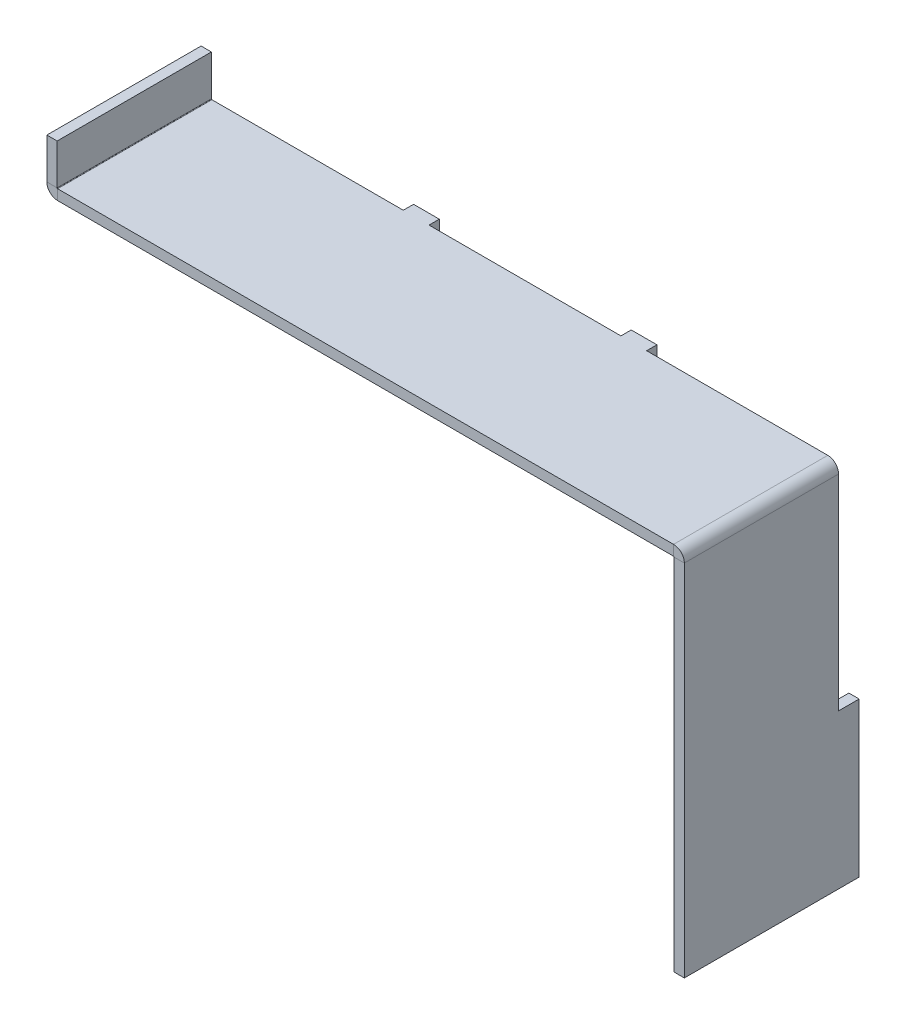
ISO-10303-21;
HEADER;
FILE_DESCRIPTION(('STEP AP214'),'2;1');
FILE_NAME('part.step','',(''),(''),'','','');
FILE_SCHEMA(('AUTOMOTIVE_DESIGN { 1 0 10303 214 1 1 1 1 }'));
ENDSEC;
DATA;
#1=APPLICATION_CONTEXT('core data for automotive mechanical design processes');
#2=APPLICATION_PROTOCOL_DEFINITION('international standard','automotive_design',2000,#1);
#3=PRODUCT_CONTEXT('',#1,'mechanical');
#4=PRODUCT('Part','Part','',(#3));
#5=PRODUCT_RELATED_PRODUCT_CATEGORY('part','',(#4));
#6=PRODUCT_DEFINITION_FORMATION('','',#4);
#7=PRODUCT_DEFINITION_CONTEXT('part definition',#1,'design');
#8=PRODUCT_DEFINITION('design','',#6,#7);
#9=PRODUCT_DEFINITION_SHAPE('','',#8);
#10=(LENGTH_UNIT() NAMED_UNIT(*) SI_UNIT(.MILLI.,.METRE.));
#11=(NAMED_UNIT(*) PLANE_ANGLE_UNIT() SI_UNIT($,.RADIAN.));
#12=(NAMED_UNIT(*) SI_UNIT($,.STERADIAN.) SOLID_ANGLE_UNIT());
#13=UNCERTAINTY_MEASURE_WITH_UNIT(LENGTH_MEASURE(1.E-05),#10,'distance_accuracy_value','');
#14=(GEOMETRIC_REPRESENTATION_CONTEXT(3) GLOBAL_UNCERTAINTY_ASSIGNED_CONTEXT((#13)) GLOBAL_UNIT_ASSIGNED_CONTEXT((#10,
#11,#12)) REPRESENTATION_CONTEXT('',''));
#15=CARTESIAN_POINT('',(0.,0.,0.));
#16=DIRECTION('',(0.,0.,1.));
#17=DIRECTION('',(1.,0.,0.));
#18=AXIS2_PLACEMENT_3D('',#15,#16,#17);
#19=CARTESIAN_POINT('',(-741.460734592372,-30.,146.));
#20=DIRECTION('',(0.,0.,-1.));
#21=DIRECTION('',(0.,1.,0.));
#22=AXIS2_PLACEMENT_3D('',#19,#20,#21);
#23=PLANE('',#22);
#24=DIRECTION('',(1.,0.,0.));
#25=VECTOR('',#24,1.);
#26=CARTESIAN_POINT('',(-741.460734592372,-1.11022302462516E-13,146.));
#27=LINE('',#26,#25);
#28=CARTESIAN_POINT('',(-588.,-1.11022302462516E-13,146.));
#29=VERTEX_POINT('',#28);
#30=CARTESIAN_POINT('',(-586.,-1.11022302462516E-13,146.));
#31=VERTEX_POINT('',#30);
#32=EDGE_CURVE('E453',#29,#31,#27,.T.);
#33=ORIENTED_EDGE('',*,*,#32,.T.);
#34=DIRECTION('',(0.,-1.,0.));
#35=VECTOR('',#34,1.);
#36=CARTESIAN_POINT('',(-586.,-1.11022302462516E-13,146.));
#37=LINE('',#36,#35);
#38=CARTESIAN_POINT('',(-586.,-30.,146.));
#39=VERTEX_POINT('',#38);
#40=EDGE_CURVE('E449',#31,#39,#37,.T.);
#41=ORIENTED_EDGE('',*,*,#40,.T.);
#42=DIRECTION('',(1.,0.,0.));
#43=VECTOR('',#42,1.);
#44=CARTESIAN_POINT('',(-741.460734592372,-30.,146.));
#45=LINE('',#44,#43);
#46=CARTESIAN_POINT('',(-588.,-30.,146.));
#47=VERTEX_POINT('',#46);
#48=EDGE_CURVE('E448',#47,#39,#45,.T.);
#49=ORIENTED_EDGE('',*,*,#48,.F.);
#50=DIRECTION('',(0.,1.,0.));
#51=VECTOR('',#50,1.);
#52=CARTESIAN_POINT('',(-588.,-30.,146.));
#53=LINE('',#52,#51);
#54=EDGE_CURVE('E444',#47,#29,#53,.T.);
#55=ORIENTED_EDGE('',*,*,#54,.T.);
#56=EDGE_LOOP('',(#33,#41,#49,#55));
#57=FACE_BOUND('',#56,.T.);
#58=ADVANCED_FACE('F45',(#57),#23,.T.);
#59=CARTESIAN_POINT('',(-741.460734592372,-30.,180.));
#60=DIRECTION('',(0.,-1.,0.));
#61=DIRECTION('',(1.,0.,0.));
#62=AXIS2_PLACEMENT_3D('',#59,#60,#61);
#63=PLANE('',#62);
#64=ORIENTED_EDGE('',*,*,#48,.T.);
#65=DIRECTION('',(0.,0.,-1.));
#66=VECTOR('',#65,1.);
#67=CARTESIAN_POINT('',(-586.,-30.,180.));
#68=LINE('',#67,#66);
#69=CARTESIAN_POINT('',(-586.,-30.,180.));
#70=VERTEX_POINT('',#69);
#71=EDGE_CURVE('E424',#70,#39,#68,.T.);
#72=ORIENTED_EDGE('',*,*,#71,.F.);
#73=DIRECTION('',(1.,0.,0.));
#74=VECTOR('',#73,1.);
#75=CARTESIAN_POINT('',(-741.460734592372,-30.,180.));
#76=LINE('',#75,#74);
#77=CARTESIAN_POINT('',(-588.,-30.,180.));
#78=VERTEX_POINT('',#77);
#79=EDGE_CURVE('E421',#78,#70,#76,.T.);
#80=ORIENTED_EDGE('',*,*,#79,.F.);
#81=DIRECTION('',(0.,0.,-1.));
#82=VECTOR('',#81,1.);
#83=CARTESIAN_POINT('',(-588.,-30.,180.));
#84=LINE('',#83,#82);
#85=EDGE_CURVE('E525',#78,#47,#84,.T.);
#86=ORIENTED_EDGE('',*,*,#85,.T.);
#87=EDGE_LOOP('',(#64,#72,#80,#86));
#88=FACE_BOUND('',#87,.T.);
#89=ADVANCED_FACE('F524',(#88),#63,.T.);
#90=CARTESIAN_POINT('',(-741.460734592372,-1.11022302462516E-13,146.));
#91=DIRECTION('',(0.,1.,0.));
#92=DIRECTION('',(-1.,0.,0.));
#93=AXIS2_PLACEMENT_3D('',#90,#91,#92);
#94=PLANE('',#93);
#95=DIRECTION('',(1.,0.,0.));
#96=VECTOR('',#95,1.);
#97=CARTESIAN_POINT('',(-741.460734592372,-1.11022302462516E-13,150.));
#98=LINE('',#97,#96);
#99=CARTESIAN_POINT('',(-588.,-1.11022302462516E-13,150.));
#100=VERTEX_POINT('',#99);
#101=CARTESIAN_POINT('',(-586.,-1.11022302462516E-13,150.));
#102=VERTEX_POINT('',#101);
#103=EDGE_CURVE('E530',#100,#102,#98,.T.);
#104=ORIENTED_EDGE('',*,*,#103,.T.);
#105=DIRECTION('',(0.,0.,-1.));
#106=VECTOR('',#105,1.);
#107=CARTESIAN_POINT('',(-586.,-1.11022302462516E-13,0.));
#108=LINE('',#107,#106);
#109=EDGE_CURVE('E435',#102,#31,#108,.T.);
#110=ORIENTED_EDGE('',*,*,#109,.T.);
#111=ORIENTED_EDGE('',*,*,#32,.F.);
#112=DIRECTION('',(0.,0.,1.));
#113=VECTOR('',#112,1.);
#114=CARTESIAN_POINT('',(-588.,-1.11022302462516E-13,146.));
#115=LINE('',#114,#113);
#116=EDGE_CURVE('E432',#29,#100,#115,.T.);
#117=ORIENTED_EDGE('',*,*,#116,.T.);
#118=EDGE_LOOP('',(#104,#110,#111,#117));
#119=FACE_BOUND('',#118,.T.);
#120=ADVANCED_FACE('F537',(#119),#94,.T.);
#121=CARTESIAN_POINT('',(-741.460734592372,41.9999999999999,150.));
#122=DIRECTION('',(0.,0.,1.));
#123=DIRECTION('',(0.,-1.,0.));
#124=AXIS2_PLACEMENT_3D('',#121,#122,#123);
#125=PLANE('',#124);
#126=DIRECTION('',(0.,-1.,0.));
#127=VECTOR('',#126,1.);
#128=CARTESIAN_POINT('',(-586.,-1.11022302462516E-13,150.));
#129=LINE('',#128,#127);
#130=CARTESIAN_POINT('',(-586.,39.8999999999999,150.));
#131=VERTEX_POINT('',#130);
#132=EDGE_CURVE('E428',#131,#102,#129,.T.);
#133=ORIENTED_EDGE('',*,*,#132,.T.);
#134=ORIENTED_EDGE('',*,*,#103,.F.);
#135=DIRECTION('',(0.,-1.,0.));
#136=VECTOR('',#135,1.);
#137=CARTESIAN_POINT('',(-588.,41.9999999999999,150.));
#138=LINE('',#137,#136);
#139=CARTESIAN_POINT('',(-588.,39.8999999999999,150.));
#140=VERTEX_POINT('',#139);
#141=EDGE_CURVE('E12',#140,#100,#138,.T.);
#142=ORIENTED_EDGE('',*,*,#141,.F.);
#143=DIRECTION('',(1.,0.,0.));
#144=VECTOR('',#143,1.);
#145=CARTESIAN_POINT('',(-741.460734592372,39.8999999999999,150.));
#146=LINE('',#145,#144);
#147=EDGE_CURVE('E427',#140,#131,#146,.T.);
#148=ORIENTED_EDGE('',*,*,#147,.T.);
#149=EDGE_LOOP('',(#133,#134,#142,#148));
#150=FACE_BOUND('',#149,.T.);
#151=ADVANCED_FACE('F538',(#150),#125,.F.);
#152=CARTESIAN_POINT('',(-586.,-1.11022302462516E-13,0.));
#153=DIRECTION('',(1.,0.,0.));
#154=DIRECTION('',(0.,0.,-1.));
#155=AXIS2_PLACEMENT_3D('',#152,#153,#154);
#156=PLANE('',#155);
#157=DIRECTION('',(0.,0.,-1.));
#158=VECTOR('',#157,1.);
#159=CARTESIAN_POINT('',(-586.,39.8999999999999,150.));
#160=LINE('',#159,#158);
#161=CARTESIAN_POINT('',(-586.,39.8999999999999,180.));
#162=VERTEX_POINT('',#161);
#163=EDGE_CURVE('E455',#162,#131,#160,.T.);
#164=ORIENTED_EDGE('',*,*,#163,.F.);
#165=DIRECTION('',(0.,1.,0.));
#166=VECTOR('',#165,1.);
#167=CARTESIAN_POINT('',(-586.,41.9999999999999,180.));
#168=LINE('',#167,#166);
#169=EDGE_CURVE('E417',#70,#162,#168,.T.);
#170=ORIENTED_EDGE('',*,*,#169,.F.);
#171=ORIENTED_EDGE('',*,*,#71,.T.);
#172=ORIENTED_EDGE('',*,*,#40,.F.);
#173=ORIENTED_EDGE('',*,*,#109,.F.);
#174=ORIENTED_EDGE('',*,*,#132,.F.);
#175=EDGE_LOOP('',(#164,#170,#171,#172,#173,#174));
#176=FACE_BOUND('',#175,.T.);
#177=ADVANCED_FACE('F518',(#176),#156,.T.);
#178=CARTESIAN_POINT('',(-741.460734592372,41.9999999999999,180.));
#179=DIRECTION('',(0.,0.,1.));
#180=DIRECTION('',(0.,-1.,0.));
#181=AXIS2_PLACEMENT_3D('',#178,#179,#180);
#182=PLANE('',#181);
#183=ORIENTED_EDGE('',*,*,#79,.T.);
#184=ORIENTED_EDGE('',*,*,#169,.T.);
#185=DIRECTION('',(1.,0.,0.));
#186=VECTOR('',#185,1.);
#187=CARTESIAN_POINT('',(-741.460734592372,39.8999999999999,180.));
#188=LINE('',#187,#186);
#189=CARTESIAN_POINT('',(-588.,39.8999999999999,180.));
#190=VERTEX_POINT('',#189);
#191=EDGE_CURVE('E49',#190,#162,#188,.T.);
#192=ORIENTED_EDGE('',*,*,#191,.F.);
#193=DIRECTION('',(0.,1.,0.));
#194=VECTOR('',#193,1.);
#195=CARTESIAN_POINT('',(-588.,41.9999999999999,180.));
#196=LINE('',#195,#194);
#197=EDGE_CURVE('E64',#78,#190,#196,.T.);
#198=ORIENTED_EDGE('',*,*,#197,.F.);
#199=EDGE_LOOP('',(#183,#184,#192,#198));
#200=FACE_BOUND('',#199,.T.);
#201=ADVANCED_FACE('F520',(#200),#182,.T.);
#202=CARTESIAN_POINT('',(-588.,-1.11022302462516E-13,0.));
#203=DIRECTION('',(1.,0.,0.));
#204=DIRECTION('',(0.,0.,-1.));
#205=AXIS2_PLACEMENT_3D('',#202,#203,#204);
#206=PLANE('',#205);
#207=ORIENTED_EDGE('',*,*,#197,.T.);
#208=DIRECTION('',(0.,0.,-1.));
#209=VECTOR('',#208,1.);
#210=CARTESIAN_POINT('',(-588.,39.8999999999999,150.));
#211=LINE('',#210,#209);
#212=EDGE_CURVE('E55',#190,#140,#211,.T.);
#213=ORIENTED_EDGE('',*,*,#212,.T.);
#214=ORIENTED_EDGE('',*,*,#141,.T.);
#215=ORIENTED_EDGE('',*,*,#116,.F.);
#216=ORIENTED_EDGE('',*,*,#54,.F.);
#217=ORIENTED_EDGE('',*,*,#85,.F.);
#218=EDGE_LOOP('',(#207,#213,#214,#215,#216,#217));
#219=FACE_BOUND('',#218,.T.);
#220=ADVANCED_FACE('F47',(#219),#206,.F.);
#221=CARTESIAN_POINT('',(-645.954532800534,50.,148.));
#222=DIRECTION('',(0.,1.,0.));
#223=DIRECTION('',(-1.,0.,0.));
#224=AXIS2_PLACEMENT_3D('',#221,#222,#223);
#225=PLANE('',#224);
#226=DIRECTION('',(0.,0.,-1.));
#227=VECTOR('',#226,1.);
#228=CARTESIAN_POINT('',(-710.,50.,180.));
#229=LINE('',#228,#227);
#230=CARTESIAN_POINT('',(-710.,50.0000000000002,180.));
#231=VERTEX_POINT('',#230);
#232=CARTESIAN_POINT('',(-710.,50.,150.));
#233=VERTEX_POINT('',#232);
#234=EDGE_CURVE('E352',#231,#233,#229,.T.);
#235=ORIENTED_EDGE('',*,*,#234,.F.);
#236=DIRECTION('',(-1.,0.,0.));
#237=VECTOR('',#236,1.);
#238=CARTESIAN_POINT('',(-645.954532800534,50.0000000000002,180.));
#239=LINE('',#238,#237);
#240=CARTESIAN_POINT('',(-708.,50.0000000000002,180.));
#241=VERTEX_POINT('',#240);
#242=EDGE_CURVE('E372',#241,#231,#239,.T.);
#243=ORIENTED_EDGE('',*,*,#242,.F.);
#244=DIRECTION('',(0.,0.,-1.));
#245=VECTOR('',#244,1.);
#246=CARTESIAN_POINT('',(-708.,50.,148.));
#247=LINE('',#246,#245);
#248=CARTESIAN_POINT('',(-708.,50.,150.));
#249=VERTEX_POINT('',#248);
#250=EDGE_CURVE('E108',#241,#249,#247,.T.);
#251=ORIENTED_EDGE('',*,*,#250,.T.);
#252=DIRECTION('',(-1.,0.,0.));
#253=VECTOR('',#252,1.);
#254=CARTESIAN_POINT('',(-645.954532800534,50.,150.));
#255=LINE('',#254,#253);
#256=EDGE_CURVE('E479',#249,#233,#255,.T.);
#257=ORIENTED_EDGE('',*,*,#256,.T.);
#258=EDGE_LOOP('',(#235,#243,#251,#257));
#259=FACE_BOUND('',#258,.T.);
#260=ADVANCED_FACE('F494',(#259),#225,.T.);
#261=CARTESIAN_POINT('',(-645.954532800534,450.,150.));
#262=DIRECTION('',(0.,0.,-1.));
#263=DIRECTION('',(0.,1.,0.));
#264=AXIS2_PLACEMENT_3D('',#261,#262,#263);
#265=PLANE('',#264);
#266=DIRECTION('',(0.,-1.,0.));
#267=VECTOR('',#266,1.);
#268=CARTESIAN_POINT('',(-710.,40.0000000000001,150.));
#269=LINE('',#268,#267);
#270=CARTESIAN_POINT('',(-710.,42.1,150.));
#271=VERTEX_POINT('',#270);
#272=EDGE_CURVE('E130',#233,#271,#269,.T.);
#273=ORIENTED_EDGE('',*,*,#272,.F.);
#274=ORIENTED_EDGE('',*,*,#256,.F.);
#275=DIRECTION('',(0.,-1.,0.));
#276=VECTOR('',#275,1.);
#277=CARTESIAN_POINT('',(-708.,450.,150.));
#278=LINE('',#277,#276);
#279=CARTESIAN_POINT('',(-708.,42.1,150.));
#280=VERTEX_POINT('',#279);
#281=EDGE_CURVE('E480',#249,#280,#278,.T.);
#282=ORIENTED_EDGE('',*,*,#281,.T.);
#283=DIRECTION('',(-1.,0.,0.));
#284=VECTOR('',#283,1.);
#285=CARTESIAN_POINT('',(-645.954532800534,42.1,150.));
#286=LINE('',#285,#284);
#287=EDGE_CURVE('E357',#280,#271,#286,.T.);
#288=ORIENTED_EDGE('',*,*,#287,.T.);
#289=EDGE_LOOP('',(#273,#274,#282,#288));
#290=FACE_BOUND('',#289,.T.);
#291=ADVANCED_FACE('F483',(#290),#265,.T.);
#292=CARTESIAN_POINT('',(-710.,40.0000000000001,180.));
#293=DIRECTION('',(1.,0.,0.));
#294=DIRECTION('',(0.,0.,-1.));
#295=AXIS2_PLACEMENT_3D('',#292,#293,#294);
#296=PLANE('',#295);
#297=ORIENTED_EDGE('',*,*,#272,.T.);
#298=DIRECTION('',(0.,0.,1.));
#299=VECTOR('',#298,1.);
#300=CARTESIAN_POINT('',(-710.,42.1,150.));
#301=LINE('',#300,#299);
#302=CARTESIAN_POINT('',(-710.,42.1,180.));
#303=VERTEX_POINT('',#302);
#304=EDGE_CURVE('E347',#271,#303,#301,.T.);
#305=ORIENTED_EDGE('',*,*,#304,.T.);
#306=DIRECTION('',(0.,-1.,0.));
#307=VECTOR('',#306,1.);
#308=CARTESIAN_POINT('',(-710.,40.0000000000001,180.));
#309=LINE('',#308,#307);
#310=EDGE_CURVE('E366',#231,#303,#309,.T.);
#311=ORIENTED_EDGE('',*,*,#310,.F.);
#312=ORIENTED_EDGE('',*,*,#234,.T.);
#313=EDGE_LOOP('',(#297,#305,#311,#312));
#314=FACE_BOUND('',#313,.T.);
#315=ADVANCED_FACE('F489',(#314),#296,.F.);
#316=CARTESIAN_POINT('',(-645.954532800534,42.,180.));
#317=DIRECTION('',(0.,0.,1.));
#318=DIRECTION('',(0.,-1.,0.));
#319=AXIS2_PLACEMENT_3D('',#316,#317,#318);
#320=PLANE('',#319);
#321=ORIENTED_EDGE('',*,*,#310,.T.);
#322=DIRECTION('',(-1.,0.,0.));
#323=VECTOR('',#322,1.);
#324=CARTESIAN_POINT('',(-645.954532800534,42.1,180.));
#325=LINE('',#324,#323);
#326=CARTESIAN_POINT('',(-708.,42.1,180.));
#327=VERTEX_POINT('',#326);
#328=EDGE_CURVE('E476',#327,#303,#325,.T.);
#329=ORIENTED_EDGE('',*,*,#328,.F.);
#330=DIRECTION('',(0.,1.,0.));
#331=VECTOR('',#330,1.);
#332=CARTESIAN_POINT('',(-708.,42.,180.));
#333=LINE('',#332,#331);
#334=EDGE_CURVE('E370',#327,#241,#333,.T.);
#335=ORIENTED_EDGE('',*,*,#334,.T.);
#336=ORIENTED_EDGE('',*,*,#242,.T.);
#337=EDGE_LOOP('',(#321,#329,#335,#336));
#338=FACE_BOUND('',#337,.T.);
#339=ADVANCED_FACE('F496',(#338),#320,.T.);
#340=CARTESIAN_POINT('',(-708.,450.,148.));
#341=DIRECTION('',(1.,0.,0.));
#342=DIRECTION('',(0.,0.,-1.));
#343=AXIS2_PLACEMENT_3D('',#340,#341,#342);
#344=PLANE('',#343);
#345=DIRECTION('',(0.,0.,1.));
#346=VECTOR('',#345,1.);
#347=CARTESIAN_POINT('',(-708.,42.1,150.));
#348=LINE('',#347,#346);
#349=EDGE_CURVE('E473',#280,#327,#348,.T.);
#350=ORIENTED_EDGE('',*,*,#349,.F.);
#351=ORIENTED_EDGE('',*,*,#281,.F.);
#352=ORIENTED_EDGE('',*,*,#250,.F.);
#353=ORIENTED_EDGE('',*,*,#334,.F.);
#354=EDGE_LOOP('',(#350,#351,#352,#353));
#355=FACE_BOUND('',#354,.T.);
#356=ADVANCED_FACE('F499',(#355),#344,.T.);
#357=CARTESIAN_POINT('',(-708.,290.000322580435,150.));
#358=DIRECTION('',(0.,0.,-1.));
#359=DIRECTION('',(-1.,0.,0.));
#360=AXIS2_PLACEMENT_3D('',#357,#358,#359);
#361=PLANE('',#360);
#362=DIRECTION('',(1.,0.,0.));
#363=VECTOR('',#362,1.);
#364=CARTESIAN_POINT('',(-588.,40.,150.));
#365=LINE('',#364,#363);
#366=CARTESIAN_POINT('',(-623.333333333333,40.,150.));
#367=VERTEX_POINT('',#366);
#368=CARTESIAN_POINT('',(-588.1,40.,150.));
#369=VERTEX_POINT('',#368);
#370=EDGE_CURVE('E146',#367,#369,#365,.T.);
#371=ORIENTED_EDGE('',*,*,#370,.F.);
#372=DIRECTION('',(0.,-1.,0.));
#373=VECTOR('',#372,1.);
#374=CARTESIAN_POINT('',(-623.333333333333,290.000322580435,150.));
#375=LINE('',#374,#373);
#376=CARTESIAN_POINT('',(-623.333333333333,42.,150.));
#377=VERTEX_POINT('',#376);
#378=EDGE_CURVE('E287',#377,#367,#375,.T.);
#379=ORIENTED_EDGE('',*,*,#378,.F.);
#380=DIRECTION('',(1.,0.,0.));
#381=VECTOR('',#380,1.);
#382=CARTESIAN_POINT('',(-708.,42.,150.));
#383=LINE('',#382,#381);
#384=CARTESIAN_POINT('',(-588.1,42.,150.));
#385=VERTEX_POINT('',#384);
#386=EDGE_CURVE('E384',#377,#385,#383,.T.);
#387=ORIENTED_EDGE('',*,*,#386,.T.);
#388=DIRECTION('',(0.,-1.,0.));
#389=VECTOR('',#388,1.);
#390=CARTESIAN_POINT('',(-588.1,290.000322580435,150.));
#391=LINE('',#390,#389);
#392=EDGE_CURVE('E253',#385,#369,#391,.T.);
#393=ORIENTED_EDGE('',*,*,#392,.T.);
#394=EDGE_LOOP('',(#371,#379,#387,#393));
#395=FACE_BOUND('',#394,.T.);
#396=ADVANCED_FACE('F514',(#395),#361,.T.);
#397=CARTESIAN_POINT('',(-623.333333333333,290.000322580435,150.));
#398=DIRECTION('',(-1.,0.,0.));
#399=DIRECTION('',(0.,-1.,0.));
#400=AXIS2_PLACEMENT_3D('',#397,#398,#399);
#401=PLANE('',#400);
#402=ORIENTED_EDGE('',*,*,#378,.T.);
#403=DIRECTION('',(0.,0.,-1.));
#404=VECTOR('',#403,1.);
#405=CARTESIAN_POINT('',(-623.333333333333,40.,150.));
#406=LINE('',#405,#404);
#407=CARTESIAN_POINT('',(-623.333333333333,40.,148.));
#408=VERTEX_POINT('',#407);
#409=EDGE_CURVE('E330',#367,#408,#406,.T.);
#410=ORIENTED_EDGE('',*,*,#409,.T.);
#411=DIRECTION('',(0.,-1.,0.));
#412=VECTOR('',#411,1.);
#413=CARTESIAN_POINT('',(-623.333333333333,290.000322580435,148.));
#414=LINE('',#413,#412);
#415=CARTESIAN_POINT('',(-623.333333333333,42.,148.));
#416=VERTEX_POINT('',#415);
#417=EDGE_CURVE('E284',#416,#408,#414,.T.);
#418=ORIENTED_EDGE('',*,*,#417,.F.);
#419=DIRECTION('',(0.,0.,-1.));
#420=VECTOR('',#419,1.);
#421=CARTESIAN_POINT('',(-623.333333333333,42.,150.));
#422=LINE('',#421,#420);
#423=EDGE_CURVE('E386',#377,#416,#422,.T.);
#424=ORIENTED_EDGE('',*,*,#423,.F.);
#425=EDGE_LOOP('',(#402,#410,#418,#424));
#426=FACE_BOUND('',#425,.T.);
#427=ADVANCED_FACE('F564',(#426),#401,.F.);
#428=CARTESIAN_POINT('',(-623.333333333333,290.000322580435,148.));
#429=DIRECTION('',(0.,0.,1.));
#430=DIRECTION('',(1.,0.,0.));
#431=AXIS2_PLACEMENT_3D('',#428,#429,#430);
#432=PLANE('',#431);
#433=ORIENTED_EDGE('',*,*,#417,.T.);
#434=DIRECTION('',(-1.,0.,0.));
#435=VECTOR('',#434,1.);
#436=CARTESIAN_POINT('',(-623.333333333333,40.,148.));
#437=LINE('',#436,#435);
#438=CARTESIAN_POINT('',(-628.333333333333,40.,148.));
#439=VERTEX_POINT('',#438);
#440=EDGE_CURVE('E327',#408,#439,#437,.T.);
#441=ORIENTED_EDGE('',*,*,#440,.T.);
#442=DIRECTION('',(0.,-1.,0.));
#443=VECTOR('',#442,1.);
#444=CARTESIAN_POINT('',(-628.333333333333,290.000322580435,148.));
#445=LINE('',#444,#443);
#446=CARTESIAN_POINT('',(-628.333333333333,42.,148.));
#447=VERTEX_POINT('',#446);
#448=EDGE_CURVE('E281',#447,#439,#445,.T.);
#449=ORIENTED_EDGE('',*,*,#448,.F.);
#450=DIRECTION('',(-1.,0.,0.));
#451=VECTOR('',#450,1.);
#452=CARTESIAN_POINT('',(-623.333333333333,42.,148.));
#453=LINE('',#452,#451);
#454=EDGE_CURVE('E889',#416,#447,#453,.T.);
#455=ORIENTED_EDGE('',*,*,#454,.F.);
#456=EDGE_LOOP('',(#433,#441,#449,#455));
#457=FACE_BOUND('',#456,.T.);
#458=ADVANCED_FACE('F567',(#457),#432,.F.);
#459=CARTESIAN_POINT('',(-628.333333333333,290.000322580435,150.));
#460=DIRECTION('',(1.,0.,0.));
#461=DIRECTION('',(0.,1.,0.));
#462=AXIS2_PLACEMENT_3D('',#459,#460,#461);
#463=PLANE('',#462);
#464=ORIENTED_EDGE('',*,*,#448,.T.);
#465=DIRECTION('',(0.,0.,1.));
#466=VECTOR('',#465,1.);
#467=CARTESIAN_POINT('',(-628.333333333333,40.,150.));
#468=LINE('',#467,#466);
#469=CARTESIAN_POINT('',(-628.333333333333,40.,150.));
#470=VERTEX_POINT('',#469);
#471=EDGE_CURVE('E324',#439,#470,#468,.T.);
#472=ORIENTED_EDGE('',*,*,#471,.T.);
#473=DIRECTION('',(0.,-1.,0.));
#474=VECTOR('',#473,1.);
#475=CARTESIAN_POINT('',(-628.333333333333,290.000322580435,150.));
#476=LINE('',#475,#474);
#477=CARTESIAN_POINT('',(-628.333333333333,42.,150.));
#478=VERTEX_POINT('',#477);
#479=EDGE_CURVE('E278',#478,#470,#476,.T.);
#480=ORIENTED_EDGE('',*,*,#479,.F.);
#481=DIRECTION('',(0.,0.,1.));
#482=VECTOR('',#481,1.);
#483=CARTESIAN_POINT('',(-628.333333333333,42.,150.));
#484=LINE('',#483,#482);
#485=EDGE_CURVE('E401',#447,#478,#484,.T.);
#486=ORIENTED_EDGE('',*,*,#485,.F.);
#487=EDGE_LOOP('',(#464,#472,#480,#486));
#488=FACE_BOUND('',#487,.T.);
#489=ADVANCED_FACE('F571',(#488),#463,.F.);
#490=CARTESIAN_POINT('',(-665.666666666667,40.,150.));
#491=VERTEX_POINT('',#490);
#492=EDGE_CURVE('E307',#491,#470,#365,.T.);
#493=ORIENTED_EDGE('',*,*,#492,.F.);
#494=DIRECTION('',(0.,-1.,0.));
#495=VECTOR('',#494,1.);
#496=CARTESIAN_POINT('',(-665.666666666667,290.000322580435,150.));
#497=LINE('',#496,#495);
#498=CARTESIAN_POINT('',(-665.666666666667,42.,150.));
#499=VERTEX_POINT('',#498);
#500=EDGE_CURVE('E275',#499,#491,#497,.T.);
#501=ORIENTED_EDGE('',*,*,#500,.F.);
#502=EDGE_CURVE('E385',#499,#478,#383,.T.);
#503=ORIENTED_EDGE('',*,*,#502,.T.);
#504=ORIENTED_EDGE('',*,*,#479,.T.);
#505=EDGE_LOOP('',(#493,#501,#503,#504));
#506=FACE_BOUND('',#505,.T.);
#507=ADVANCED_FACE('F575',(#506),#361,.T.);
#508=CARTESIAN_POINT('',(-665.666666666667,290.000322580435,150.));
#509=DIRECTION('',(-1.,0.,0.));
#510=DIRECTION('',(0.,-1.,0.));
#511=AXIS2_PLACEMENT_3D('',#508,#509,#510);
#512=PLANE('',#511);
#513=ORIENTED_EDGE('',*,*,#500,.T.);
#514=DIRECTION('',(0.,0.,-1.));
#515=VECTOR('',#514,1.);
#516=CARTESIAN_POINT('',(-665.666666666667,40.,150.));
#517=LINE('',#516,#515);
#518=CARTESIAN_POINT('',(-665.666666666667,40.,148.));
#519=VERTEX_POINT('',#518);
#520=EDGE_CURVE('E321',#491,#519,#517,.T.);
#521=ORIENTED_EDGE('',*,*,#520,.T.);
#522=DIRECTION('',(0.,-1.,0.));
#523=VECTOR('',#522,1.);
#524=CARTESIAN_POINT('',(-665.666666666667,290.000322580435,148.));
#525=LINE('',#524,#523);
#526=CARTESIAN_POINT('',(-665.666666666667,42.,148.));
#527=VERTEX_POINT('',#526);
#528=EDGE_CURVE('E272',#527,#519,#525,.T.);
#529=ORIENTED_EDGE('',*,*,#528,.F.);
#530=DIRECTION('',(0.,0.,-1.));
#531=VECTOR('',#530,1.);
#532=CARTESIAN_POINT('',(-665.666666666667,42.,150.));
#533=LINE('',#532,#531);
#534=EDGE_CURVE('E398',#499,#527,#533,.T.);
#535=ORIENTED_EDGE('',*,*,#534,.F.);
#536=EDGE_LOOP('',(#513,#521,#529,#535));
#537=FACE_BOUND('',#536,.T.);
#538=ADVANCED_FACE('F577',(#537),#512,.F.);
#539=CARTESIAN_POINT('',(-665.666666666667,290.000322580435,148.));
#540=DIRECTION('',(0.,0.,1.));
#541=DIRECTION('',(1.,0.,0.));
#542=AXIS2_PLACEMENT_3D('',#539,#540,#541);
#543=PLANE('',#542);
#544=ORIENTED_EDGE('',*,*,#528,.T.);
#545=DIRECTION('',(-1.,0.,0.));
#546=VECTOR('',#545,1.);
#547=CARTESIAN_POINT('',(-665.666666666667,40.,148.));
#548=LINE('',#547,#546);
#549=CARTESIAN_POINT('',(-670.666666666667,40.,148.));
#550=VERTEX_POINT('',#549);
#551=EDGE_CURVE('E319',#519,#550,#548,.T.);
#552=ORIENTED_EDGE('',*,*,#551,.T.);
#553=DIRECTION('',(0.,-1.,0.));
#554=VECTOR('',#553,1.);
#555=CARTESIAN_POINT('',(-670.666666666667,290.000322580435,148.));
#556=LINE('',#555,#554);
#557=CARTESIAN_POINT('',(-670.666666666667,42.,148.));
#558=VERTEX_POINT('',#557);
#559=EDGE_CURVE('E269',#558,#550,#556,.T.);
#560=ORIENTED_EDGE('',*,*,#559,.F.);
#561=DIRECTION('',(-1.,0.,0.));
#562=VECTOR('',#561,1.);
#563=CARTESIAN_POINT('',(-665.666666666667,42.,148.));
#564=LINE('',#563,#562);
#565=EDGE_CURVE('E400',#527,#558,#564,.T.);
#566=ORIENTED_EDGE('',*,*,#565,.F.);
#567=EDGE_LOOP('',(#544,#552,#560,#566));
#568=FACE_BOUND('',#567,.T.);
#569=ADVANCED_FACE('F580',(#568),#543,.F.);
#570=CARTESIAN_POINT('',(-670.666666666667,290.000322580435,150.));
#571=DIRECTION('',(1.,0.,0.));
#572=DIRECTION('',(0.,1.,0.));
#573=AXIS2_PLACEMENT_3D('',#570,#571,#572);
#574=PLANE('',#573);
#575=ORIENTED_EDGE('',*,*,#559,.T.);
#576=DIRECTION('',(0.,0.,1.));
#577=VECTOR('',#576,1.);
#578=CARTESIAN_POINT('',(-670.666666666667,40.,150.));
#579=LINE('',#578,#577);
#580=CARTESIAN_POINT('',(-670.666666666667,40.,150.));
#581=VERTEX_POINT('',#580);
#582=EDGE_CURVE('E306',#550,#581,#579,.T.);
#583=ORIENTED_EDGE('',*,*,#582,.T.);
#584=DIRECTION('',(0.,-1.,0.));
#585=VECTOR('',#584,1.);
#586=CARTESIAN_POINT('',(-670.666666666667,290.000322580435,150.));
#587=LINE('',#586,#585);
#588=CARTESIAN_POINT('',(-670.666666666667,42.,150.));
#589=VERTEX_POINT('',#588);
#590=EDGE_CURVE('E266',#589,#581,#587,.T.);
#591=ORIENTED_EDGE('',*,*,#590,.F.);
#592=DIRECTION('',(0.,0.,1.));
#593=VECTOR('',#592,1.);
#594=CARTESIAN_POINT('',(-670.666666666667,42.,150.));
#595=LINE('',#594,#593);
#596=EDGE_CURVE('E405',#558,#589,#595,.T.);
#597=ORIENTED_EDGE('',*,*,#596,.F.);
#598=EDGE_LOOP('',(#575,#583,#591,#597));
#599=FACE_BOUND('',#598,.T.);
#600=ADVANCED_FACE('F584',(#599),#574,.F.);
#601=CARTESIAN_POINT('',(-707.9,40.,150.));
#602=VERTEX_POINT('',#601);
#603=EDGE_CURVE('E301',#602,#581,#365,.T.);
#604=ORIENTED_EDGE('',*,*,#603,.F.);
#605=DIRECTION('',(0.,-1.,0.));
#606=VECTOR('',#605,1.);
#607=CARTESIAN_POINT('',(-707.9,290.000322580435,150.));
#608=LINE('',#607,#606);
#609=CARTESIAN_POINT('',(-707.9,42.,150.));
#610=VERTEX_POINT('',#609);
#611=EDGE_CURVE('E260',#610,#602,#608,.T.);
#612=ORIENTED_EDGE('',*,*,#611,.F.);
#613=EDGE_CURVE('E381',#610,#589,#383,.T.);
#614=ORIENTED_EDGE('',*,*,#613,.T.);
#615=ORIENTED_EDGE('',*,*,#590,.T.);
#616=EDGE_LOOP('',(#604,#612,#614,#615));
#617=FACE_BOUND('',#616,.T.);
#618=ADVANCED_FACE('F588',(#617),#361,.T.);
#619=CARTESIAN_POINT('',(-588.,290.000322580435,180.));
#620=DIRECTION('',(0.,0.,1.));
#621=DIRECTION('',(1.,0.,0.));
#622=AXIS2_PLACEMENT_3D('',#619,#620,#621);
#623=PLANE('',#622);
#624=DIRECTION('',(-1.,0.,0.));
#625=VECTOR('',#624,1.);
#626=CARTESIAN_POINT('',(-588.,40.,180.));
#627=LINE('',#626,#625);
#628=CARTESIAN_POINT('',(-588.1,40.,180.));
#629=VERTEX_POINT('',#628);
#630=CARTESIAN_POINT('',(-707.9,40.,180.));
#631=VERTEX_POINT('',#630);
#632=EDGE_CURVE('E252',#629,#631,#627,.T.);
#633=ORIENTED_EDGE('',*,*,#632,.F.);
#634=DIRECTION('',(0.,-1.,0.));
#635=VECTOR('',#634,1.);
#636=CARTESIAN_POINT('',(-588.1,290.000322580435,180.));
#637=LINE('',#636,#635);
#638=CARTESIAN_POINT('',(-588.1,42.,180.));
#639=VERTEX_POINT('',#638);
#640=EDGE_CURVE('E235',#639,#629,#637,.T.);
#641=ORIENTED_EDGE('',*,*,#640,.F.);
#642=DIRECTION('',(-1.,0.,0.));
#643=VECTOR('',#642,1.);
#644=CARTESIAN_POINT('',(-588.,42.,180.));
#645=LINE('',#644,#643);
#646=CARTESIAN_POINT('',(-707.9,42.,180.));
#647=VERTEX_POINT('',#646);
#648=EDGE_CURVE('E246',#639,#647,#645,.T.);
#649=ORIENTED_EDGE('',*,*,#648,.T.);
#650=DIRECTION('',(0.,-1.,0.));
#651=VECTOR('',#650,1.);
#652=CARTESIAN_POINT('',(-707.9,290.000322580435,180.));
#653=LINE('',#652,#651);
#654=EDGE_CURVE('E258',#647,#631,#653,.T.);
#655=ORIENTED_EDGE('',*,*,#654,.T.);
#656=EDGE_LOOP('',(#633,#641,#649,#655));
#657=FACE_BOUND('',#656,.T.);
#658=ADVANCED_FACE('F256',(#657),#623,.T.);
#659=CARTESIAN_POINT('',(-708.,42.,148.));
#660=DIRECTION('',(0.,1.,0.));
#661=DIRECTION('',(-1.,0.,0.));
#662=AXIS2_PLACEMENT_3D('',#659,#660,#661);
#663=PLANE('',#662);
#664=DIRECTION('',(0.,0.,1.));
#665=VECTOR('',#664,1.);
#666=CARTESIAN_POINT('',(-588.1,42.,150.));
#667=LINE('',#666,#665);
#668=EDGE_CURVE('E225',#385,#639,#667,.T.);
#669=ORIENTED_EDGE('',*,*,#668,.F.);
#670=ORIENTED_EDGE('',*,*,#386,.F.);
#671=ORIENTED_EDGE('',*,*,#423,.T.);
#672=ORIENTED_EDGE('',*,*,#454,.T.);
#673=ORIENTED_EDGE('',*,*,#485,.T.);
#674=ORIENTED_EDGE('',*,*,#502,.F.);
#675=ORIENTED_EDGE('',*,*,#534,.T.);
#676=ORIENTED_EDGE('',*,*,#565,.T.);
#677=ORIENTED_EDGE('',*,*,#596,.T.);
#678=ORIENTED_EDGE('',*,*,#613,.F.);
#679=DIRECTION('',(0.,0.,1.));
#680=VECTOR('',#679,1.);
#681=CARTESIAN_POINT('',(-707.9,42.,150.));
#682=LINE('',#681,#680);
#683=EDGE_CURVE('E236',#610,#647,#682,.T.);
#684=ORIENTED_EDGE('',*,*,#683,.T.);
#685=ORIENTED_EDGE('',*,*,#648,.F.);
#686=EDGE_LOOP('',(#669,#670,#671,#672,#673,#674,#675,#676,#677,#678,#684,#685));
#687=FACE_BOUND('',#686,.T.);
#688=ADVANCED_FACE('F247',(#687),#663,.T.);
#689=CARTESIAN_POINT('',(-588.,40.,180.));
#690=DIRECTION('',(0.,1.,0.));
#691=DIRECTION('',(0.,0.,1.));
#692=AXIS2_PLACEMENT_3D('',#689,#690,#691);
#693=PLANE('',#692);
#694=ORIENTED_EDGE('',*,*,#370,.T.);
#695=DIRECTION('',(0.,0.,1.));
#696=VECTOR('',#695,1.);
#697=CARTESIAN_POINT('',(-588.1,40.,150.));
#698=LINE('',#697,#696);
#699=EDGE_CURVE('E336',#369,#629,#698,.T.);
#700=ORIENTED_EDGE('',*,*,#699,.T.);
#701=ORIENTED_EDGE('',*,*,#632,.T.);
#702=DIRECTION('',(0.,0.,1.));
#703=VECTOR('',#702,1.);
#704=CARTESIAN_POINT('',(-707.9,40.,150.));
#705=LINE('',#704,#703);
#706=EDGE_CURVE('E333',#602,#631,#705,.T.);
#707=ORIENTED_EDGE('',*,*,#706,.F.);
#708=ORIENTED_EDGE('',*,*,#603,.T.);
#709=ORIENTED_EDGE('',*,*,#582,.F.);
#710=ORIENTED_EDGE('',*,*,#551,.F.);
#711=ORIENTED_EDGE('',*,*,#520,.F.);
#712=ORIENTED_EDGE('',*,*,#492,.T.);
#713=ORIENTED_EDGE('',*,*,#471,.F.);
#714=ORIENTED_EDGE('',*,*,#440,.F.);
#715=ORIENTED_EDGE('',*,*,#409,.F.);
#716=EDGE_LOOP('',(#694,#700,#701,#707,#708,#709,#710,#711,#712,#713,#714,#715));
#717=FACE_BOUND('',#716,.T.);
#718=ADVANCED_FACE('F509',(#717),#693,.F.);
#719=CARTESIAN_POINT('',(-707.9,42.1,180.));
#720=DIRECTION('',(0.,0.,1.));
#721=DIRECTION('',(1.,0.,0.));
#722=AXIS2_PLACEMENT_3D('',#719,#720,#721);
#723=PLANE('',#722);
#724=ORIENTED_EDGE('',*,*,#654,.F.);
#725=CARTESIAN_POINT('',(-707.9,42.1,180.));
#726=DIRECTION('',(0.,0.,1.));
#727=DIRECTION('',(1.,0.,0.));
#728=AXIS2_PLACEMENT_3D('',#725,#726,#727);
#729=CIRCLE('',#728,0.100000000000017);
#730=EDGE_CURVE('E308',#647,#327,#729,.F.);
#731=ORIENTED_EDGE('',*,*,#730,.T.);
#732=ORIENTED_EDGE('',*,*,#328,.T.);
#733=CARTESIAN_POINT('',(-707.9,42.1,180.));
#734=DIRECTION('',(0.,0.,1.));
#735=DIRECTION('',(1.,0.,0.));
#736=AXIS2_PLACEMENT_3D('',#733,#734,#735);
#737=CIRCLE('',#736,2.10000000000002);
#738=EDGE_CURVE('E123',#631,#303,#737,.F.);
#739=ORIENTED_EDGE('',*,*,#738,.F.);
#740=EDGE_LOOP('',(#724,#731,#732,#739));
#741=FACE_BOUND('',#740,.T.);
#742=ADVANCED_FACE('F505',(#741),#723,.T.);
#743=CARTESIAN_POINT('',(-707.9,42.1,150.));
#744=DIRECTION('',(0.,0.,-1.));
#745=DIRECTION('',(-1.,0.,0.));
#746=AXIS2_PLACEMENT_3D('',#743,#744,#745);
#747=PLANE('',#746);
#748=ORIENTED_EDGE('',*,*,#287,.F.);
#749=CARTESIAN_POINT('',(-707.9,42.1,150.));
#750=DIRECTION('',(0.,0.,1.));
#751=DIRECTION('',(1.,0.,0.));
#752=AXIS2_PLACEMENT_3D('',#749,#750,#751);
#753=CIRCLE('',#752,0.100000000000017);
#754=EDGE_CURVE('E461',#280,#610,#753,.T.);
#755=ORIENTED_EDGE('',*,*,#754,.T.);
#756=ORIENTED_EDGE('',*,*,#611,.T.);
#757=CARTESIAN_POINT('',(-707.9,42.1,150.));
#758=DIRECTION('',(0.,0.,1.));
#759=DIRECTION('',(1.,0.,0.));
#760=AXIS2_PLACEMENT_3D('',#757,#758,#759);
#761=CIRCLE('',#760,2.10000000000002);
#762=EDGE_CURVE('E465',#271,#602,#761,.T.);
#763=ORIENTED_EDGE('',*,*,#762,.F.);
#764=EDGE_LOOP('',(#748,#755,#756,#763));
#765=FACE_BOUND('',#764,.T.);
#766=ADVANCED_FACE('F600',(#765),#747,.T.);
#767=CARTESIAN_POINT('',(-707.9,42.1,-52.0906727189556));
#768=DIRECTION('',(0.,0.,1.));
#769=DIRECTION('',(1.,0.,0.));
#770=AXIS2_PLACEMENT_3D('',#767,#768,#769);
#771=CYLINDRICAL_SURFACE('',#770,2.10000000000002);
#772=ORIENTED_EDGE('',*,*,#762,.T.);
#773=ORIENTED_EDGE('',*,*,#706,.T.);
#774=ORIENTED_EDGE('',*,*,#738,.T.);
#775=ORIENTED_EDGE('',*,*,#304,.F.);
#776=EDGE_LOOP('',(#772,#773,#774,#775));
#777=FACE_BOUND('',#776,.T.);
#778=ADVANCED_FACE('F603',(#777),#771,.T.);
#779=CARTESIAN_POINT('',(-707.9,42.1,-52.0906727189556));
#780=DIRECTION('',(0.,0.,1.));
#781=DIRECTION('',(1.,0.,0.));
#782=AXIS2_PLACEMENT_3D('',#779,#780,#781);
#783=CYLINDRICAL_SURFACE('',#782,0.100000000000017);
#784=ORIENTED_EDGE('',*,*,#754,.F.);
#785=ORIENTED_EDGE('',*,*,#349,.T.);
#786=ORIENTED_EDGE('',*,*,#730,.F.);
#787=ORIENTED_EDGE('',*,*,#683,.F.);
#788=EDGE_LOOP('',(#784,#785,#786,#787));
#789=FACE_BOUND('',#788,.T.);
#790=ADVANCED_FACE('F503',(#789),#783,.F.);
#791=CARTESIAN_POINT('',(-588.1,39.9,150.));
#792=DIRECTION('',(0.,0.,1.));
#793=DIRECTION('',(1.,0.,0.));
#794=AXIS2_PLACEMENT_3D('',#791,#792,#793);
#795=PLANE('',#794);
#796=ORIENTED_EDGE('',*,*,#147,.F.);
#797=CARTESIAN_POINT('',(-588.1,39.9,150.));
#798=DIRECTION('',(0.,0.,1.));
#799=DIRECTION('',(0.,-1.,0.));
#800=AXIS2_PLACEMENT_3D('',#797,#798,#799);
#801=CIRCLE('',#800,0.100000000000018);
#802=EDGE_CURVE('E138',#369,#140,#801,.F.);
#803=ORIENTED_EDGE('',*,*,#802,.F.);
#804=ORIENTED_EDGE('',*,*,#392,.F.);
#805=CARTESIAN_POINT('',(-588.1,39.9,150.));
#806=DIRECTION('',(0.,0.,1.));
#807=DIRECTION('',(0.,-1.,0.));
#808=AXIS2_PLACEMENT_3D('',#805,#806,#807);
#809=CIRCLE('',#808,2.10000000000002);
#810=EDGE_CURVE('E231',#385,#131,#809,.F.);
#811=ORIENTED_EDGE('',*,*,#810,.T.);
#812=EDGE_LOOP('',(#796,#803,#804,#811));
#813=FACE_BOUND('',#812,.T.);
#814=ADVANCED_FACE('F515',(#813),#795,.F.);
#815=CARTESIAN_POINT('',(-588.1,39.8999999999999,180.));
#816=DIRECTION('',(0.,0.,-1.));
#817=DIRECTION('',(0.,1.,0.));
#818=AXIS2_PLACEMENT_3D('',#815,#816,#817);
#819=PLANE('',#818);
#820=ORIENTED_EDGE('',*,*,#640,.T.);
#821=CARTESIAN_POINT('',(-588.1,39.8999999999999,180.));
#822=DIRECTION('',(0.,0.,1.));
#823=DIRECTION('',(0.,-1.,0.));
#824=AXIS2_PLACEMENT_3D('',#821,#822,#823);
#825=CIRCLE('',#824,0.100000000000018);
#826=EDGE_CURVE('E462',#190,#629,#825,.T.);
#827=ORIENTED_EDGE('',*,*,#826,.F.);
#828=ORIENTED_EDGE('',*,*,#191,.T.);
#829=CARTESIAN_POINT('',(-588.1,39.8999999999999,180.));
#830=DIRECTION('',(0.,0.,1.));
#831=DIRECTION('',(0.,-1.,0.));
#832=AXIS2_PLACEMENT_3D('',#829,#830,#831);
#833=CIRCLE('',#832,2.10000000000002);
#834=EDGE_CURVE('E229',#162,#639,#833,.T.);
#835=ORIENTED_EDGE('',*,*,#834,.T.);
#836=EDGE_LOOP('',(#820,#827,#828,#835));
#837=FACE_BOUND('',#836,.T.);
#838=ADVANCED_FACE('F239',(#837),#819,.F.);
#839=CARTESIAN_POINT('',(-588.1,39.9,-45.8335007091482));
#840=DIRECTION('',(0.,0.,1.));
#841=DIRECTION('',(0.,-1.,0.));
#842=AXIS2_PLACEMENT_3D('',#839,#840,#841);
#843=CYLINDRICAL_SURFACE('',#842,2.10000000000002);
#844=ORIENTED_EDGE('',*,*,#834,.F.);
#845=ORIENTED_EDGE('',*,*,#163,.T.);
#846=ORIENTED_EDGE('',*,*,#810,.F.);
#847=ORIENTED_EDGE('',*,*,#668,.T.);
#848=EDGE_LOOP('',(#844,#845,#846,#847));
#849=FACE_BOUND('',#848,.T.);
#850=ADVANCED_FACE('F227',(#849),#843,.T.);
#851=CARTESIAN_POINT('',(-588.1,39.9,-45.8335007091482));
#852=DIRECTION('',(0.,0.,1.));
#853=DIRECTION('',(0.,-1.,0.));
#854=AXIS2_PLACEMENT_3D('',#851,#852,#853);
#855=CYLINDRICAL_SURFACE('',#854,0.100000000000018);
#856=ORIENTED_EDGE('',*,*,#826,.T.);
#857=ORIENTED_EDGE('',*,*,#699,.F.);
#858=ORIENTED_EDGE('',*,*,#802,.T.);
#859=ORIENTED_EDGE('',*,*,#212,.F.);
#860=EDGE_LOOP('',(#856,#857,#858,#859));
#861=FACE_BOUND('',#860,.T.);
#862=ADVANCED_FACE('F512',(#861),#855,.F.);
#863=CLOSED_SHELL('',(#58,#89,#120,#151,#177,#201,#220,#260,#291,#315,#339,#356,#396,#427,#458,
#489,#507,#538,#569,#600,#618,#658,#688,#718,#742,#766,#778,#790,#814,#838,#850,#862));
#864=MANIFOLD_SOLID_BREP('B2',#863);
#865=ADVANCED_BREP_SHAPE_REPRESENTATION('',(#18,#864),#14);
#866=SHAPE_DEFINITION_REPRESENTATION(#9,#865);
ENDSEC;
END-ISO-10303-21;
